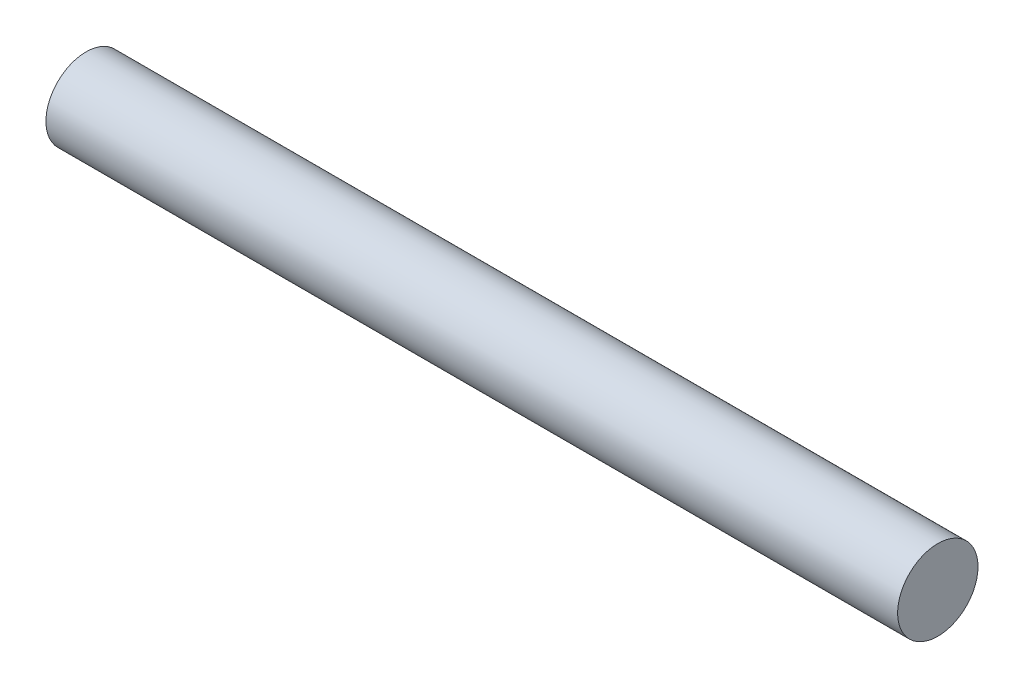
ISO-10303-21;
HEADER;
FILE_DESCRIPTION(('STEP AP214'),'2;1');
FILE_NAME('part.step','',(''),(''),'','','');
FILE_SCHEMA(('AUTOMOTIVE_DESIGN { 1 0 10303 214 1 1 1 1 }'));
ENDSEC;
DATA;
#1=APPLICATION_CONTEXT('core data for automotive mechanical design processes');
#2=APPLICATION_PROTOCOL_DEFINITION('international standard','automotive_design',2000,#1);
#3=PRODUCT_CONTEXT('',#1,'mechanical');
#4=PRODUCT('Part','Part','',(#3));
#5=PRODUCT_RELATED_PRODUCT_CATEGORY('part','',(#4));
#6=PRODUCT_DEFINITION_FORMATION('','',#4);
#7=PRODUCT_DEFINITION_CONTEXT('part definition',#1,'design');
#8=PRODUCT_DEFINITION('design','',#6,#7);
#9=PRODUCT_DEFINITION_SHAPE('','',#8);
#10=(LENGTH_UNIT() NAMED_UNIT(*) SI_UNIT(.MILLI.,.METRE.));
#11=(NAMED_UNIT(*) PLANE_ANGLE_UNIT() SI_UNIT($,.RADIAN.));
#12=(NAMED_UNIT(*) SI_UNIT($,.STERADIAN.) SOLID_ANGLE_UNIT());
#13=UNCERTAINTY_MEASURE_WITH_UNIT(LENGTH_MEASURE(1.E-05),#10,'distance_accuracy_value','');
#14=(GEOMETRIC_REPRESENTATION_CONTEXT(3) GLOBAL_UNCERTAINTY_ASSIGNED_CONTEXT((#13)) GLOBAL_UNIT_ASSIGNED_CONTEXT((#10,
#11,#12)) REPRESENTATION_CONTEXT('',''));
#15=CARTESIAN_POINT('',(0.,0.,0.));
#16=DIRECTION('',(0.,0.,1.));
#17=DIRECTION('',(1.,0.,0.));
#18=AXIS2_PLACEMENT_3D('',#15,#16,#17);
#19=CARTESIAN_POINT('',(53.,0.,0.));
#20=DIRECTION('',(-1.,0.,0.));
#21=DIRECTION('',(0.,0.,1.));
#22=AXIS2_PLACEMENT_3D('',#19,#20,#21);
#23=CYLINDRICAL_SURFACE('',#22,2.5);
#24=CARTESIAN_POINT('',(53.,0.,0.));
#25=DIRECTION('',(1.,0.,0.));
#26=DIRECTION('',(0.,0.,-1.));
#27=AXIS2_PLACEMENT_3D('',#24,#25,#26);
#28=CIRCLE('',#27,2.5);
#29=CARTESIAN_POINT('',(53.,0.,-2.5));
#30=VERTEX_POINT('',#29);
#31=EDGE_CURVE('E10',#30,#30,#28,.T.);
#32=ORIENTED_EDGE('',*,*,#31,.F.);
#33=EDGE_LOOP('',(#32));
#34=FACE_BOUND('',#33,.T.);
#35=CARTESIAN_POINT('',(0.,0.,0.));
#36=DIRECTION('',(1.,0.,0.));
#37=DIRECTION('',(0.,0.,-1.));
#38=AXIS2_PLACEMENT_3D('',#35,#36,#37);
#39=CIRCLE('',#38,2.5);
#40=CARTESIAN_POINT('',(0.,0.,-2.5));
#41=VERTEX_POINT('',#40);
#42=EDGE_CURVE('E44',#41,#41,#39,.T.);
#43=ORIENTED_EDGE('',*,*,#42,.T.);
#44=EDGE_LOOP('',(#43));
#45=FACE_BOUND('',#44,.T.);
#46=ADVANCED_FACE('F41',(#34,#45),#23,.T.);
#47=CARTESIAN_POINT('',(53.,0.,0.));
#48=DIRECTION('',(1.,0.,0.));
#49=DIRECTION('',(0.,0.,-1.));
#50=AXIS2_PLACEMENT_3D('',#47,#48,#49);
#51=PLANE('',#50);
#52=ORIENTED_EDGE('',*,*,#31,.T.);
#53=EDGE_LOOP('',(#52));
#54=FACE_BOUND('',#53,.T.);
#55=ADVANCED_FACE('F58',(#54),#51,.T.);
#56=CARTESIAN_POINT('',(0.,0.,0.));
#57=DIRECTION('',(1.,0.,0.));
#58=DIRECTION('',(0.,0.,-1.));
#59=AXIS2_PLACEMENT_3D('',#56,#57,#58);
#60=PLANE('',#59);
#61=ORIENTED_EDGE('',*,*,#42,.F.);
#62=EDGE_LOOP('',(#61));
#63=FACE_BOUND('',#62,.T.);
#64=ADVANCED_FACE('F56',(#63),#60,.F.);
#65=CLOSED_SHELL('',(#46,#55,#64));
#66=MANIFOLD_SOLID_BREP('B2',#65);
#67=ADVANCED_BREP_SHAPE_REPRESENTATION('',(#18,#66),#14);
#68=SHAPE_DEFINITION_REPRESENTATION(#9,#67);
ENDSEC;
END-ISO-10303-21;
